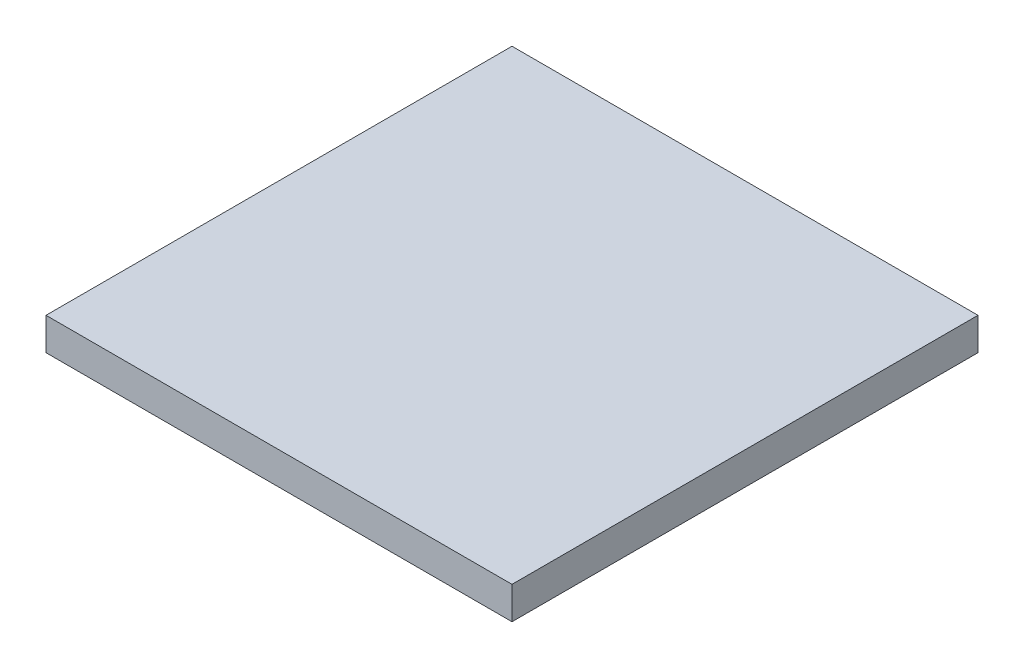
ISO-10303-21;
HEADER;
FILE_DESCRIPTION(('STEP AP214'),'2;1');
FILE_NAME('part.step','',(''),(''),'','','');
FILE_SCHEMA(('AUTOMOTIVE_DESIGN { 1 0 10303 214 1 1 1 1 }'));
ENDSEC;
DATA;
#1=APPLICATION_CONTEXT('core data for automotive mechanical design processes');
#2=APPLICATION_PROTOCOL_DEFINITION('international standard','automotive_design',2000,#1);
#3=PRODUCT_CONTEXT('',#1,'mechanical');
#4=PRODUCT('Part','Part','',(#3));
#5=PRODUCT_RELATED_PRODUCT_CATEGORY('part','',(#4));
#6=PRODUCT_DEFINITION_FORMATION('','',#4);
#7=PRODUCT_DEFINITION_CONTEXT('part definition',#1,'design');
#8=PRODUCT_DEFINITION('design','',#6,#7);
#9=PRODUCT_DEFINITION_SHAPE('','',#8);
#10=(LENGTH_UNIT() NAMED_UNIT(*) SI_UNIT(.MILLI.,.METRE.));
#11=(NAMED_UNIT(*) PLANE_ANGLE_UNIT() SI_UNIT($,.RADIAN.));
#12=(NAMED_UNIT(*) SI_UNIT($,.STERADIAN.) SOLID_ANGLE_UNIT());
#13=UNCERTAINTY_MEASURE_WITH_UNIT(LENGTH_MEASURE(1.E-05),#10,'distance_accuracy_value','');
#14=(GEOMETRIC_REPRESENTATION_CONTEXT(3) GLOBAL_UNCERTAINTY_ASSIGNED_CONTEXT((#13)) GLOBAL_UNIT_ASSIGNED_CONTEXT((#10,
#11,#12)) REPRESENTATION_CONTEXT('',''));
#15=CARTESIAN_POINT('',(0.,0.,0.));
#16=DIRECTION('',(0.,0.,1.));
#17=DIRECTION('',(1.,0.,0.));
#18=AXIS2_PLACEMENT_3D('',#15,#16,#17);
#19=CARTESIAN_POINT('',(-11.5,1.6,11.5));
#20=DIRECTION('',(1.,0.,0.));
#21=DIRECTION('',(0.,0.,-1.));
#22=AXIS2_PLACEMENT_3D('',#19,#20,#21);
#23=PLANE('',#22);
#24=DIRECTION('',(0.,0.,1.));
#25=VECTOR('',#24,1.);
#26=CARTESIAN_POINT('',(-11.5,0.,11.5));
#27=LINE('',#26,#25);
#28=CARTESIAN_POINT('',(-11.5,0.,-11.5));
#29=VERTEX_POINT('',#28);
#30=CARTESIAN_POINT('',(-11.5,0.,11.5));
#31=VERTEX_POINT('',#30);
#32=EDGE_CURVE('E105',#29,#31,#27,.T.);
#33=ORIENTED_EDGE('',*,*,#32,.T.);
#34=DIRECTION('',(0.,-1.,0.));
#35=VECTOR('',#34,1.);
#36=CARTESIAN_POINT('',(-11.5,1.6,11.5));
#37=LINE('',#36,#35);
#38=CARTESIAN_POINT('',(-11.5,1.6,11.5));
#39=VERTEX_POINT('',#38);
#40=EDGE_CURVE('E11',#39,#31,#37,.T.);
#41=ORIENTED_EDGE('',*,*,#40,.F.);
#42=DIRECTION('',(0.,0.,1.));
#43=VECTOR('',#42,1.);
#44=CARTESIAN_POINT('',(-11.5,1.6,11.5));
#45=LINE('',#44,#43);
#46=CARTESIAN_POINT('',(-11.5,1.6,-11.5));
#47=VERTEX_POINT('',#46);
#48=EDGE_CURVE('E89',#47,#39,#45,.T.);
#49=ORIENTED_EDGE('',*,*,#48,.F.);
#50=DIRECTION('',(0.,-1.,0.));
#51=VECTOR('',#50,1.);
#52=CARTESIAN_POINT('',(-11.5,1.6,-11.5));
#53=LINE('',#52,#51);
#54=EDGE_CURVE('E97',#47,#29,#53,.T.);
#55=ORIENTED_EDGE('',*,*,#54,.T.);
#56=EDGE_LOOP('',(#33,#41,#49,#55));
#57=FACE_BOUND('',#56,.T.);
#58=ADVANCED_FACE('F39',(#57),#23,.F.);
#59=CARTESIAN_POINT('',(-11.5,1.6,11.5));
#60=DIRECTION('',(0.,0.,-1.));
#61=DIRECTION('',(-1.,0.,0.));
#62=AXIS2_PLACEMENT_3D('',#59,#60,#61);
#63=PLANE('',#62);
#64=DIRECTION('',(1.,0.,0.));
#65=VECTOR('',#64,1.);
#66=CARTESIAN_POINT('',(-11.5,0.,11.5));
#67=LINE('',#66,#65);
#68=CARTESIAN_POINT('',(11.5,0.,11.5));
#69=VERTEX_POINT('',#68);
#70=EDGE_CURVE('E92',#31,#69,#67,.T.);
#71=ORIENTED_EDGE('',*,*,#70,.T.);
#72=DIRECTION('',(0.,-1.,0.));
#73=VECTOR('',#72,1.);
#74=CARTESIAN_POINT('',(11.5,1.6,11.5));
#75=LINE('',#74,#73);
#76=CARTESIAN_POINT('',(11.5,1.6,11.5));
#77=VERTEX_POINT('',#76);
#78=EDGE_CURVE('E50',#77,#69,#75,.T.);
#79=ORIENTED_EDGE('',*,*,#78,.F.);
#80=DIRECTION('',(1.,0.,0.));
#81=VECTOR('',#80,1.);
#82=CARTESIAN_POINT('',(-11.5,1.6,11.5));
#83=LINE('',#82,#81);
#84=EDGE_CURVE('E82',#39,#77,#83,.T.);
#85=ORIENTED_EDGE('',*,*,#84,.F.);
#86=ORIENTED_EDGE('',*,*,#40,.T.);
#87=EDGE_LOOP('',(#71,#79,#85,#86));
#88=FACE_BOUND('',#87,.T.);
#89=ADVANCED_FACE('F93',(#88),#63,.F.);
#90=CARTESIAN_POINT('',(11.5,1.6,11.5));
#91=DIRECTION('',(-1.,0.,0.));
#92=DIRECTION('',(0.,0.,1.));
#93=AXIS2_PLACEMENT_3D('',#90,#91,#92);
#94=PLANE('',#93);
#95=DIRECTION('',(0.,0.,-1.));
#96=VECTOR('',#95,1.);
#97=CARTESIAN_POINT('',(11.5,0.,11.5));
#98=LINE('',#97,#96);
#99=CARTESIAN_POINT('',(11.5,0.,-11.5));
#100=VERTEX_POINT('',#99);
#101=EDGE_CURVE('E72',#69,#100,#98,.T.);
#102=ORIENTED_EDGE('',*,*,#101,.T.);
#103=DIRECTION('',(0.,-1.,0.));
#104=VECTOR('',#103,1.);
#105=CARTESIAN_POINT('',(11.5,1.6,-11.5));
#106=LINE('',#105,#104);
#107=CARTESIAN_POINT('',(11.5,1.6,-11.5));
#108=VERTEX_POINT('',#107);
#109=EDGE_CURVE('E94',#108,#100,#106,.T.);
#110=ORIENTED_EDGE('',*,*,#109,.F.);
#111=DIRECTION('',(0.,0.,-1.));
#112=VECTOR('',#111,1.);
#113=CARTESIAN_POINT('',(11.5,1.6,11.5));
#114=LINE('',#113,#112);
#115=EDGE_CURVE('E88',#77,#108,#114,.T.);
#116=ORIENTED_EDGE('',*,*,#115,.F.);
#117=ORIENTED_EDGE('',*,*,#78,.T.);
#118=EDGE_LOOP('',(#102,#110,#116,#117));
#119=FACE_BOUND('',#118,.T.);
#120=ADVANCED_FACE('F96',(#119),#94,.F.);
#121=CARTESIAN_POINT('',(-11.5,1.6,-11.5));
#122=DIRECTION('',(0.,0.,1.));
#123=DIRECTION('',(1.,0.,0.));
#124=AXIS2_PLACEMENT_3D('',#121,#122,#123);
#125=PLANE('',#124);
#126=DIRECTION('',(-1.,0.,0.));
#127=VECTOR('',#126,1.);
#128=CARTESIAN_POINT('',(-11.5,0.,-11.5));
#129=LINE('',#128,#127);
#130=EDGE_CURVE('E76',#100,#29,#129,.T.);
#131=ORIENTED_EDGE('',*,*,#130,.T.);
#132=ORIENTED_EDGE('',*,*,#54,.F.);
#133=DIRECTION('',(-1.,0.,0.));
#134=VECTOR('',#133,1.);
#135=CARTESIAN_POINT('',(-11.5,1.6,-11.5));
#136=LINE('',#135,#134);
#137=EDGE_CURVE('E54',#108,#47,#136,.T.);
#138=ORIENTED_EDGE('',*,*,#137,.F.);
#139=ORIENTED_EDGE('',*,*,#109,.T.);
#140=EDGE_LOOP('',(#131,#132,#138,#139));
#141=FACE_BOUND('',#140,.T.);
#142=ADVANCED_FACE('F108',(#141),#125,.F.);
#143=CARTESIAN_POINT('',(0.,1.6,0.));
#144=DIRECTION('',(0.,-1.,0.));
#145=DIRECTION('',(0.,0.,-1.));
#146=AXIS2_PLACEMENT_3D('',#143,#144,#145);
#147=PLANE('',#146);
#148=ORIENTED_EDGE('',*,*,#48,.T.);
#149=ORIENTED_EDGE('',*,*,#84,.T.);
#150=ORIENTED_EDGE('',*,*,#115,.T.);
#151=ORIENTED_EDGE('',*,*,#137,.T.);
#152=EDGE_LOOP('',(#148,#149,#150,#151));
#153=FACE_BOUND('',#152,.T.);
#154=ADVANCED_FACE('F86',(#153),#147,.F.);
#155=CARTESIAN_POINT('',(0.,0.,0.));
#156=DIRECTION('',(0.,-1.,0.));
#157=DIRECTION('',(0.,0.,-1.));
#158=AXIS2_PLACEMENT_3D('',#155,#156,#157);
#159=PLANE('',#158);
#160=ORIENTED_EDGE('',*,*,#32,.F.);
#161=ORIENTED_EDGE('',*,*,#130,.F.);
#162=ORIENTED_EDGE('',*,*,#101,.F.);
#163=ORIENTED_EDGE('',*,*,#70,.F.);
#164=EDGE_LOOP('',(#160,#161,#162,#163));
#165=FACE_BOUND('',#164,.T.);
#166=ADVANCED_FACE('F115',(#165),#159,.T.);
#167=CLOSED_SHELL('',(#58,#89,#120,#142,#154,#166));
#168=MANIFOLD_SOLID_BREP('B2',#167);
#169=ADVANCED_BREP_SHAPE_REPRESENTATION('',(#18,#168),#14);
#170=SHAPE_DEFINITION_REPRESENTATION(#9,#169);
ENDSEC;
END-ISO-10303-21;
